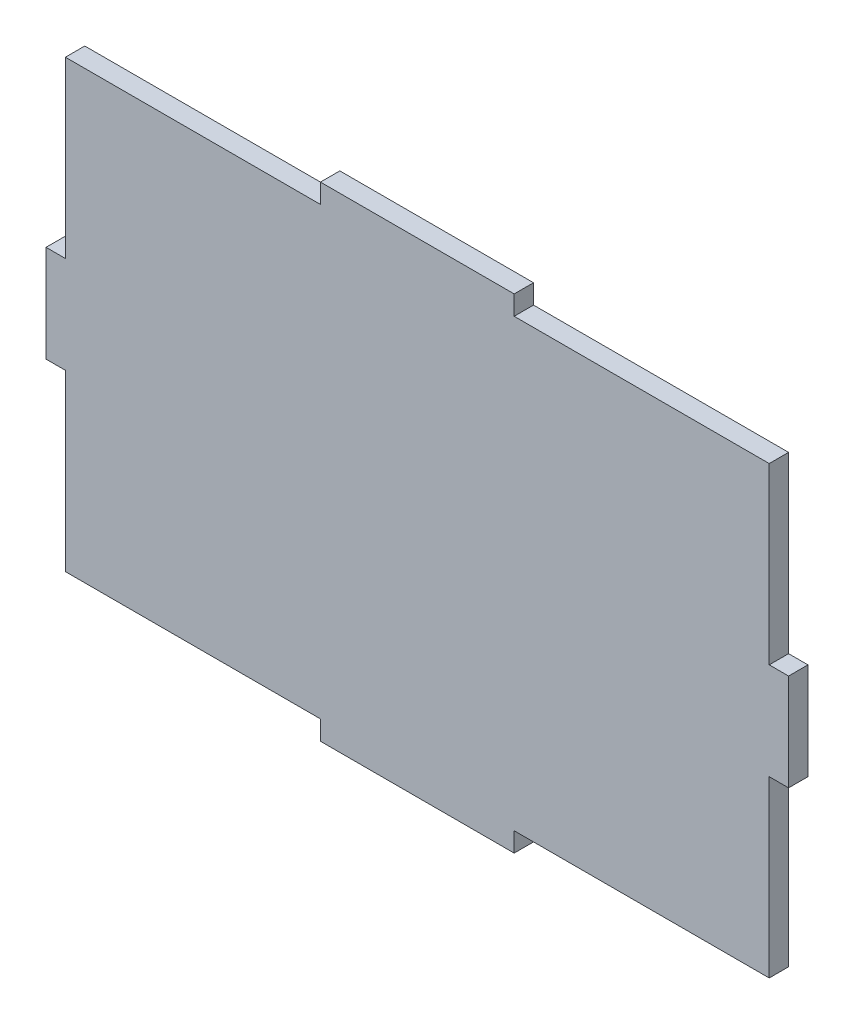
ISO-10303-21;
HEADER;
FILE_DESCRIPTION(('STEP AP214'),'2;1');
FILE_NAME('part.step','',(''),(''),'','','');
FILE_SCHEMA(('AUTOMOTIVE_DESIGN { 1 0 10303 214 1 1 1 1 }'));
ENDSEC;
DATA;
#1=APPLICATION_CONTEXT('core data for automotive mechanical design processes');
#2=APPLICATION_PROTOCOL_DEFINITION('international standard','automotive_design',2000,#1);
#3=PRODUCT_CONTEXT('',#1,'mechanical');
#4=PRODUCT('Part','Part','',(#3));
#5=PRODUCT_RELATED_PRODUCT_CATEGORY('part','',(#4));
#6=PRODUCT_DEFINITION_FORMATION('','',#4);
#7=PRODUCT_DEFINITION_CONTEXT('part definition',#1,'design');
#8=PRODUCT_DEFINITION('design','',#6,#7);
#9=PRODUCT_DEFINITION_SHAPE('','',#8);
#10=(LENGTH_UNIT() NAMED_UNIT(*) SI_UNIT(.MILLI.,.METRE.));
#11=(NAMED_UNIT(*) PLANE_ANGLE_UNIT() SI_UNIT($,.RADIAN.));
#12=(NAMED_UNIT(*) SI_UNIT($,.STERADIAN.) SOLID_ANGLE_UNIT());
#13=UNCERTAINTY_MEASURE_WITH_UNIT(LENGTH_MEASURE(1.E-05),#10,'distance_accuracy_value','');
#14=(GEOMETRIC_REPRESENTATION_CONTEXT(3) GLOBAL_UNCERTAINTY_ASSIGNED_CONTEXT((#13)) GLOBAL_UNIT_ASSIGNED_CONTEXT((#10,
#11,#12)) REPRESENTATION_CONTEXT('',''));
#15=CARTESIAN_POINT('',(0.,0.,0.));
#16=DIRECTION('',(0.,0.,1.));
#17=DIRECTION('',(1.,0.,0.));
#18=AXIS2_PLACEMENT_3D('',#15,#16,#17);
#19=CARTESIAN_POINT('',(0.,30.,3.));
#20=DIRECTION('',(0.,-1.,0.));
#21=DIRECTION('',(0.,0.,-1.));
#22=AXIS2_PLACEMENT_3D('',#19,#20,#21);
#23=PLANE('',#22);
#24=DIRECTION('',(-1.,0.,0.));
#25=VECTOR('',#24,1.);
#26=CARTESIAN_POINT('',(0.,30.,0.));
#27=LINE('',#26,#25);
#28=CARTESIAN_POINT('',(3.,30.,0.));
#29=VERTEX_POINT('',#28);
#30=CARTESIAN_POINT('',(0.,30.,0.));
#31=VERTEX_POINT('',#30);
#32=EDGE_CURVE('E202',#29,#31,#27,.T.);
#33=ORIENTED_EDGE('',*,*,#32,.F.);
#34=DIRECTION('',(0.,0.,-1.));
#35=VECTOR('',#34,1.);
#36=CARTESIAN_POINT('',(3.,30.,3.));
#37=LINE('',#36,#35);
#38=CARTESIAN_POINT('',(3.,30.,3.));
#39=VERTEX_POINT('',#38);
#40=EDGE_CURVE('E11',#39,#29,#37,.T.);
#41=ORIENTED_EDGE('',*,*,#40,.F.);
#42=DIRECTION('',(-1.,0.,0.));
#43=VECTOR('',#42,1.);
#44=CARTESIAN_POINT('',(0.,30.,3.));
#45=LINE('',#44,#43);
#46=CARTESIAN_POINT('',(0.,30.,3.));
#47=VERTEX_POINT('',#46);
#48=EDGE_CURVE('E258',#39,#47,#45,.T.);
#49=ORIENTED_EDGE('',*,*,#48,.T.);
#50=DIRECTION('',(0.,0.,-1.));
#51=VECTOR('',#50,1.);
#52=CARTESIAN_POINT('',(0.,30.,3.));
#53=LINE('',#52,#51);
#54=EDGE_CURVE('E53',#47,#31,#53,.T.);
#55=ORIENTED_EDGE('',*,*,#54,.T.);
#56=EDGE_LOOP('',(#33,#41,#49,#55));
#57=FACE_BOUND('',#56,.T.);
#58=ADVANCED_FACE('F37',(#57),#23,.T.);
#59=CARTESIAN_POINT('',(3.,0.,3.));
#60=DIRECTION('',(-1.,0.,0.));
#61=DIRECTION('',(0.,-1.,0.));
#62=AXIS2_PLACEMENT_3D('',#59,#60,#61);
#63=PLANE('',#62);
#64=DIRECTION('',(0.,1.,0.));
#65=VECTOR('',#64,1.);
#66=CARTESIAN_POINT('',(3.,0.,0.));
#67=LINE('',#66,#65);
#68=CARTESIAN_POINT('',(3.,2.99999999999999,0.));
#69=VERTEX_POINT('',#68);
#70=EDGE_CURVE('E204',#69,#29,#67,.T.);
#71=ORIENTED_EDGE('',*,*,#70,.F.);
#72=DIRECTION('',(0.,0.,-1.));
#73=VECTOR('',#72,1.);
#74=CARTESIAN_POINT('',(3.,2.99999999999999,3.));
#75=LINE('',#74,#73);
#76=CARTESIAN_POINT('',(3.,2.99999999999999,3.));
#77=VERTEX_POINT('',#76);
#78=EDGE_CURVE('E45',#77,#69,#75,.T.);
#79=ORIENTED_EDGE('',*,*,#78,.F.);
#80=DIRECTION('',(0.,1.,0.));
#81=VECTOR('',#80,1.);
#82=CARTESIAN_POINT('',(3.,0.,3.));
#83=LINE('',#82,#81);
#84=EDGE_CURVE('E310',#77,#39,#83,.T.);
#85=ORIENTED_EDGE('',*,*,#84,.T.);
#86=ORIENTED_EDGE('',*,*,#40,.T.);
#87=EDGE_LOOP('',(#71,#79,#85,#86));
#88=FACE_BOUND('',#87,.T.);
#89=ADVANCED_FACE('F299',(#88),#63,.T.);
#90=CARTESIAN_POINT('',(0.,2.99999999999999,3.));
#91=DIRECTION('',(0.,-1.,0.));
#92=DIRECTION('',(1.,0.,0.));
#93=AXIS2_PLACEMENT_3D('',#90,#91,#92);
#94=PLANE('',#93);
#95=DIRECTION('',(-1.,0.,0.));
#96=VECTOR('',#95,1.);
#97=CARTESIAN_POINT('',(0.,2.99999999999999,0.));
#98=LINE('',#97,#96);
#99=CARTESIAN_POINT('',(42.5,3.,0.));
#100=VERTEX_POINT('',#99);
#101=EDGE_CURVE('E207',#100,#69,#98,.T.);
#102=ORIENTED_EDGE('',*,*,#101,.F.);
#103=DIRECTION('',(0.,0.,-1.));
#104=VECTOR('',#103,1.);
#105=CARTESIAN_POINT('',(42.5,3.,3.));
#106=LINE('',#105,#104);
#107=CARTESIAN_POINT('',(42.5,3.,3.));
#108=VERTEX_POINT('',#107);
#109=EDGE_CURVE('E288',#108,#100,#106,.T.);
#110=ORIENTED_EDGE('',*,*,#109,.F.);
#111=DIRECTION('',(-1.,0.,0.));
#112=VECTOR('',#111,1.);
#113=CARTESIAN_POINT('',(0.,2.99999999999999,3.));
#114=LINE('',#113,#112);
#115=EDGE_CURVE('E295',#108,#77,#114,.T.);
#116=ORIENTED_EDGE('',*,*,#115,.T.);
#117=ORIENTED_EDGE('',*,*,#78,.T.);
#118=EDGE_LOOP('',(#102,#110,#116,#117));
#119=FACE_BOUND('',#118,.T.);
#120=ADVANCED_FACE('F293',(#119),#94,.T.);
#121=CARTESIAN_POINT('',(42.5,0.,3.));
#122=DIRECTION('',(-1.,0.,0.));
#123=DIRECTION('',(0.,0.,1.));
#124=AXIS2_PLACEMENT_3D('',#121,#122,#123);
#125=PLANE('',#124);
#126=DIRECTION('',(0.,1.,0.));
#127=VECTOR('',#126,1.);
#128=CARTESIAN_POINT('',(42.5,0.,0.));
#129=LINE('',#128,#127);
#130=CARTESIAN_POINT('',(42.5,0.,0.));
#131=VERTEX_POINT('',#130);
#132=EDGE_CURVE('E210',#131,#100,#129,.T.);
#133=ORIENTED_EDGE('',*,*,#132,.F.);
#134=DIRECTION('',(0.,0.,-1.));
#135=VECTOR('',#134,1.);
#136=CARTESIAN_POINT('',(42.5,0.,3.));
#137=LINE('',#136,#135);
#138=CARTESIAN_POINT('',(42.5,0.,3.));
#139=VERTEX_POINT('',#138);
#140=EDGE_CURVE('E286',#139,#131,#137,.T.);
#141=ORIENTED_EDGE('',*,*,#140,.F.);
#142=DIRECTION('',(0.,1.,0.));
#143=VECTOR('',#142,1.);
#144=CARTESIAN_POINT('',(42.5,0.,3.));
#145=LINE('',#144,#143);
#146=EDGE_CURVE('E309',#139,#108,#145,.T.);
#147=ORIENTED_EDGE('',*,*,#146,.T.);
#148=ORIENTED_EDGE('',*,*,#109,.T.);
#149=EDGE_LOOP('',(#133,#141,#147,#148));
#150=FACE_BOUND('',#149,.T.);
#151=ADVANCED_FACE('F305',(#150),#125,.T.);
#152=CARTESIAN_POINT('',(0.,0.,3.));
#153=DIRECTION('',(0.,1.,0.));
#154=DIRECTION('',(0.,0.,1.));
#155=AXIS2_PLACEMENT_3D('',#152,#153,#154);
#156=PLANE('',#155);
#157=DIRECTION('',(1.,0.,0.));
#158=VECTOR('',#157,1.);
#159=CARTESIAN_POINT('',(0.,0.,0.));
#160=LINE('',#159,#158);
#161=CARTESIAN_POINT('',(72.5,0.,0.));
#162=VERTEX_POINT('',#161);
#163=EDGE_CURVE('E213',#131,#162,#160,.T.);
#164=ORIENTED_EDGE('',*,*,#163,.T.);
#165=DIRECTION('',(0.,0.,-1.));
#166=VECTOR('',#165,1.);
#167=CARTESIAN_POINT('',(72.5,0.,3.));
#168=LINE('',#167,#166);
#169=CARTESIAN_POINT('',(72.5,0.,3.));
#170=VERTEX_POINT('',#169);
#171=EDGE_CURVE('E284',#170,#162,#168,.T.);
#172=ORIENTED_EDGE('',*,*,#171,.F.);
#173=DIRECTION('',(1.,0.,0.));
#174=VECTOR('',#173,1.);
#175=CARTESIAN_POINT('',(0.,0.,3.));
#176=LINE('',#175,#174);
#177=EDGE_CURVE('E312',#139,#170,#176,.T.);
#178=ORIENTED_EDGE('',*,*,#177,.F.);
#179=ORIENTED_EDGE('',*,*,#140,.T.);
#180=EDGE_LOOP('',(#164,#172,#178,#179));
#181=FACE_BOUND('',#180,.T.);
#182=ADVANCED_FACE('F374',(#181),#156,.F.);
#183=CARTESIAN_POINT('',(72.5,0.,3.));
#184=DIRECTION('',(1.,0.,0.));
#185=DIRECTION('',(0.,0.,-1.));
#186=AXIS2_PLACEMENT_3D('',#183,#184,#185);
#187=PLANE('',#186);
#188=DIRECTION('',(0.,-1.,0.));
#189=VECTOR('',#188,1.);
#190=CARTESIAN_POINT('',(72.5,0.,0.));
#191=LINE('',#190,#189);
#192=CARTESIAN_POINT('',(72.5,3.,0.));
#193=VERTEX_POINT('',#192);
#194=EDGE_CURVE('E216',#193,#162,#191,.T.);
#195=ORIENTED_EDGE('',*,*,#194,.F.);
#196=DIRECTION('',(0.,0.,-1.));
#197=VECTOR('',#196,1.);
#198=CARTESIAN_POINT('',(72.5,3.,3.));
#199=LINE('',#198,#197);
#200=CARTESIAN_POINT('',(72.5,3.,3.));
#201=VERTEX_POINT('',#200);
#202=EDGE_CURVE('E282',#201,#193,#199,.T.);
#203=ORIENTED_EDGE('',*,*,#202,.F.);
#204=DIRECTION('',(0.,-1.,0.));
#205=VECTOR('',#204,1.);
#206=CARTESIAN_POINT('',(72.5,0.,3.));
#207=LINE('',#206,#205);
#208=EDGE_CURVE('E318',#201,#170,#207,.T.);
#209=ORIENTED_EDGE('',*,*,#208,.T.);
#210=ORIENTED_EDGE('',*,*,#171,.T.);
#211=EDGE_LOOP('',(#195,#203,#209,#210));
#212=FACE_BOUND('',#211,.T.);
#213=ADVANCED_FACE('F377',(#212),#187,.T.);
#214=CARTESIAN_POINT('',(0.,2.99999999999998,3.));
#215=DIRECTION('',(0.,-1.,0.));
#216=DIRECTION('',(1.,0.,0.));
#217=AXIS2_PLACEMENT_3D('',#214,#215,#216);
#218=PLANE('',#217);
#219=DIRECTION('',(-1.,0.,0.));
#220=VECTOR('',#219,1.);
#221=CARTESIAN_POINT('',(0.,2.99999999999998,0.));
#222=LINE('',#221,#220);
#223=CARTESIAN_POINT('',(112.,3.00000000000001,0.));
#224=VERTEX_POINT('',#223);
#225=EDGE_CURVE('E219',#224,#193,#222,.T.);
#226=ORIENTED_EDGE('',*,*,#225,.F.);
#227=DIRECTION('',(0.,0.,-1.));
#228=VECTOR('',#227,1.);
#229=CARTESIAN_POINT('',(112.,3.00000000000001,3.));
#230=LINE('',#229,#228);
#231=CARTESIAN_POINT('',(112.,3.00000000000001,3.));
#232=VERTEX_POINT('',#231);
#233=EDGE_CURVE('E280',#232,#224,#230,.T.);
#234=ORIENTED_EDGE('',*,*,#233,.F.);
#235=DIRECTION('',(-1.,0.,0.));
#236=VECTOR('',#235,1.);
#237=CARTESIAN_POINT('',(0.,2.99999999999998,3.));
#238=LINE('',#237,#236);
#239=EDGE_CURVE('E321',#232,#201,#238,.T.);
#240=ORIENTED_EDGE('',*,*,#239,.T.);
#241=ORIENTED_EDGE('',*,*,#202,.T.);
#242=EDGE_LOOP('',(#226,#234,#240,#241));
#243=FACE_BOUND('',#242,.T.);
#244=ADVANCED_FACE('F381',(#243),#218,.T.);
#245=CARTESIAN_POINT('',(112.,0.,3.));
#246=DIRECTION('',(1.,0.,0.));
#247=DIRECTION('',(0.,0.,-1.));
#248=AXIS2_PLACEMENT_3D('',#245,#246,#247);
#249=PLANE('',#248);
#250=DIRECTION('',(0.,-1.,0.));
#251=VECTOR('',#250,1.);
#252=CARTESIAN_POINT('',(112.,0.,0.));
#253=LINE('',#252,#251);
#254=CARTESIAN_POINT('',(112.,30.,0.));
#255=VERTEX_POINT('',#254);
#256=EDGE_CURVE('E222',#255,#224,#253,.T.);
#257=ORIENTED_EDGE('',*,*,#256,.F.);
#258=DIRECTION('',(0.,0.,-1.));
#259=VECTOR('',#258,1.);
#260=CARTESIAN_POINT('',(112.,30.,3.));
#261=LINE('',#260,#259);
#262=CARTESIAN_POINT('',(112.,30.,3.));
#263=VERTEX_POINT('',#262);
#264=EDGE_CURVE('E278',#263,#255,#261,.T.);
#265=ORIENTED_EDGE('',*,*,#264,.F.);
#266=DIRECTION('',(0.,-1.,0.));
#267=VECTOR('',#266,1.);
#268=CARTESIAN_POINT('',(112.,0.,3.));
#269=LINE('',#268,#267);
#270=EDGE_CURVE('E324',#263,#232,#269,.T.);
#271=ORIENTED_EDGE('',*,*,#270,.T.);
#272=ORIENTED_EDGE('',*,*,#233,.T.);
#273=EDGE_LOOP('',(#257,#265,#271,#272));
#274=FACE_BOUND('',#273,.T.);
#275=ADVANCED_FACE('F385',(#274),#249,.T.);
#276=CARTESIAN_POINT('',(0.,30.,3.));
#277=DIRECTION('',(0.,-1.,0.));
#278=DIRECTION('',(0.,0.,-1.));
#279=AXIS2_PLACEMENT_3D('',#276,#277,#278);
#280=PLANE('',#279);
#281=DIRECTION('',(-1.,0.,0.));
#282=VECTOR('',#281,1.);
#283=CARTESIAN_POINT('',(0.,30.,0.));
#284=LINE('',#283,#282);
#285=CARTESIAN_POINT('',(115.,30.,0.));
#286=VERTEX_POINT('',#285);
#287=EDGE_CURVE('E225',#286,#255,#284,.T.);
#288=ORIENTED_EDGE('',*,*,#287,.F.);
#289=DIRECTION('',(0.,0.,-1.));
#290=VECTOR('',#289,1.);
#291=CARTESIAN_POINT('',(115.,30.,3.));
#292=LINE('',#291,#290);
#293=CARTESIAN_POINT('',(115.,30.,3.));
#294=VERTEX_POINT('',#293);
#295=EDGE_CURVE('E276',#294,#286,#292,.T.);
#296=ORIENTED_EDGE('',*,*,#295,.F.);
#297=DIRECTION('',(-1.,0.,0.));
#298=VECTOR('',#297,1.);
#299=CARTESIAN_POINT('',(0.,30.,3.));
#300=LINE('',#299,#298);
#301=EDGE_CURVE('E327',#294,#263,#300,.T.);
#302=ORIENTED_EDGE('',*,*,#301,.T.);
#303=ORIENTED_EDGE('',*,*,#264,.T.);
#304=EDGE_LOOP('',(#288,#296,#302,#303));
#305=FACE_BOUND('',#304,.T.);
#306=ADVANCED_FACE('F389',(#305),#280,.T.);
#307=CARTESIAN_POINT('',(115.,0.,3.));
#308=DIRECTION('',(-1.,0.,0.));
#309=DIRECTION('',(0.,0.,1.));
#310=AXIS2_PLACEMENT_3D('',#307,#308,#309);
#311=PLANE('',#310);
#312=DIRECTION('',(0.,1.,0.));
#313=VECTOR('',#312,1.);
#314=CARTESIAN_POINT('',(115.,0.,0.));
#315=LINE('',#314,#313);
#316=CARTESIAN_POINT('',(115.,45.,0.));
#317=VERTEX_POINT('',#316);
#318=EDGE_CURVE('E228',#286,#317,#315,.T.);
#319=ORIENTED_EDGE('',*,*,#318,.T.);
#320=DIRECTION('',(0.,0.,-1.));
#321=VECTOR('',#320,1.);
#322=CARTESIAN_POINT('',(115.,45.,3.));
#323=LINE('',#322,#321);
#324=CARTESIAN_POINT('',(115.,45.,3.));
#325=VERTEX_POINT('',#324);
#326=EDGE_CURVE('E274',#325,#317,#323,.T.);
#327=ORIENTED_EDGE('',*,*,#326,.F.);
#328=DIRECTION('',(0.,1.,0.));
#329=VECTOR('',#328,1.);
#330=CARTESIAN_POINT('',(115.,0.,3.));
#331=LINE('',#330,#329);
#332=EDGE_CURVE('E330',#294,#325,#331,.T.);
#333=ORIENTED_EDGE('',*,*,#332,.F.);
#334=ORIENTED_EDGE('',*,*,#295,.T.);
#335=EDGE_LOOP('',(#319,#327,#333,#334));
#336=FACE_BOUND('',#335,.T.);
#337=ADVANCED_FACE('F393',(#336),#311,.F.);
#338=CARTESIAN_POINT('',(0.,45.,3.));
#339=DIRECTION('',(0.,1.,0.));
#340=DIRECTION('',(0.,0.,1.));
#341=AXIS2_PLACEMENT_3D('',#338,#339,#340);
#342=PLANE('',#341);
#343=DIRECTION('',(1.,0.,0.));
#344=VECTOR('',#343,1.);
#345=CARTESIAN_POINT('',(0.,45.,0.));
#346=LINE('',#345,#344);
#347=CARTESIAN_POINT('',(112.,45.,0.));
#348=VERTEX_POINT('',#347);
#349=EDGE_CURVE('E231',#348,#317,#346,.T.);
#350=ORIENTED_EDGE('',*,*,#349,.F.);
#351=DIRECTION('',(0.,0.,-1.));
#352=VECTOR('',#351,1.);
#353=CARTESIAN_POINT('',(112.,45.,3.));
#354=LINE('',#353,#352);
#355=CARTESIAN_POINT('',(112.,45.,3.));
#356=VERTEX_POINT('',#355);
#357=EDGE_CURVE('E272',#356,#348,#354,.T.);
#358=ORIENTED_EDGE('',*,*,#357,.F.);
#359=DIRECTION('',(1.,0.,0.));
#360=VECTOR('',#359,1.);
#361=CARTESIAN_POINT('',(0.,45.,3.));
#362=LINE('',#361,#360);
#363=EDGE_CURVE('E332',#356,#325,#362,.T.);
#364=ORIENTED_EDGE('',*,*,#363,.T.);
#365=ORIENTED_EDGE('',*,*,#326,.T.);
#366=EDGE_LOOP('',(#350,#358,#364,#365));
#367=FACE_BOUND('',#366,.T.);
#368=ADVANCED_FACE('F397',(#367),#342,.T.);
#369=CARTESIAN_POINT('',(112.,0.,3.));
#370=DIRECTION('',(1.,0.,0.));
#371=DIRECTION('',(0.,0.,-1.));
#372=AXIS2_PLACEMENT_3D('',#369,#370,#371);
#373=PLANE('',#372);
#374=DIRECTION('',(0.,-1.,0.));
#375=VECTOR('',#374,1.);
#376=CARTESIAN_POINT('',(112.,0.,0.));
#377=LINE('',#376,#375);
#378=CARTESIAN_POINT('',(112.,72.,0.));
#379=VERTEX_POINT('',#378);
#380=EDGE_CURVE('E234',#379,#348,#377,.T.);
#381=ORIENTED_EDGE('',*,*,#380,.F.);
#382=DIRECTION('',(0.,0.,-1.));
#383=VECTOR('',#382,1.);
#384=CARTESIAN_POINT('',(112.,72.,3.));
#385=LINE('',#384,#383);
#386=CARTESIAN_POINT('',(112.,72.,3.));
#387=VERTEX_POINT('',#386);
#388=EDGE_CURVE('E270',#387,#379,#385,.T.);
#389=ORIENTED_EDGE('',*,*,#388,.F.);
#390=DIRECTION('',(0.,-1.,0.));
#391=VECTOR('',#390,1.);
#392=CARTESIAN_POINT('',(112.,0.,3.));
#393=LINE('',#392,#391);
#394=EDGE_CURVE('E335',#387,#356,#393,.T.);
#395=ORIENTED_EDGE('',*,*,#394,.T.);
#396=ORIENTED_EDGE('',*,*,#357,.T.);
#397=EDGE_LOOP('',(#381,#389,#395,#396));
#398=FACE_BOUND('',#397,.T.);
#399=ADVANCED_FACE('F401',(#398),#373,.T.);
#400=CARTESIAN_POINT('',(0.,72.,3.));
#401=DIRECTION('',(0.,1.,0.));
#402=DIRECTION('',(0.,0.,1.));
#403=AXIS2_PLACEMENT_3D('',#400,#401,#402);
#404=PLANE('',#403);
#405=DIRECTION('',(1.,0.,0.));
#406=VECTOR('',#405,1.);
#407=CARTESIAN_POINT('',(0.,72.,0.));
#408=LINE('',#407,#406);
#409=CARTESIAN_POINT('',(72.5,72.,0.));
#410=VERTEX_POINT('',#409);
#411=EDGE_CURVE('E237',#410,#379,#408,.T.);
#412=ORIENTED_EDGE('',*,*,#411,.F.);
#413=DIRECTION('',(0.,0.,-1.));
#414=VECTOR('',#413,1.);
#415=CARTESIAN_POINT('',(72.5,72.,3.));
#416=LINE('',#415,#414);
#417=CARTESIAN_POINT('',(72.5,72.,3.));
#418=VERTEX_POINT('',#417);
#419=EDGE_CURVE('E268',#418,#410,#416,.T.);
#420=ORIENTED_EDGE('',*,*,#419,.F.);
#421=DIRECTION('',(1.,0.,0.));
#422=VECTOR('',#421,1.);
#423=CARTESIAN_POINT('',(0.,72.,3.));
#424=LINE('',#423,#422);
#425=EDGE_CURVE('E338',#418,#387,#424,.T.);
#426=ORIENTED_EDGE('',*,*,#425,.T.);
#427=ORIENTED_EDGE('',*,*,#388,.T.);
#428=EDGE_LOOP('',(#412,#420,#426,#427));
#429=FACE_BOUND('',#428,.T.);
#430=ADVANCED_FACE('F405',(#429),#404,.T.);
#431=CARTESIAN_POINT('',(72.4999999999997,-3.35379872022181E-13,3.));
#432=DIRECTION('',(1.,0.,0.));
#433=DIRECTION('',(0.,1.,0.));
#434=AXIS2_PLACEMENT_3D('',#431,#432,#433);
#435=PLANE('',#434);
#436=DIRECTION('',(0.,-1.,0.));
#437=VECTOR('',#436,1.);
#438=CARTESIAN_POINT('',(72.4999999999997,-3.35379872022181E-13,0.));
#439=LINE('',#438,#437);
#440=CARTESIAN_POINT('',(72.5,75.,0.));
#441=VERTEX_POINT('',#440);
#442=EDGE_CURVE('E240',#441,#410,#439,.T.);
#443=ORIENTED_EDGE('',*,*,#442,.F.);
#444=DIRECTION('',(0.,0.,-1.));
#445=VECTOR('',#444,1.);
#446=CARTESIAN_POINT('',(72.5,75.,3.));
#447=LINE('',#446,#445);
#448=CARTESIAN_POINT('',(72.5,75.,3.));
#449=VERTEX_POINT('',#448);
#450=EDGE_CURVE('E266',#449,#441,#447,.T.);
#451=ORIENTED_EDGE('',*,*,#450,.F.);
#452=DIRECTION('',(0.,-1.,0.));
#453=VECTOR('',#452,1.);
#454=CARTESIAN_POINT('',(72.4999999999997,-3.35379872022181E-13,3.));
#455=LINE('',#454,#453);
#456=EDGE_CURVE('E341',#449,#418,#455,.T.);
#457=ORIENTED_EDGE('',*,*,#456,.T.);
#458=ORIENTED_EDGE('',*,*,#419,.T.);
#459=EDGE_LOOP('',(#443,#451,#457,#458));
#460=FACE_BOUND('',#459,.T.);
#461=ADVANCED_FACE('F409',(#460),#435,.T.);
#462=CARTESIAN_POINT('',(0.,75.,3.));
#463=DIRECTION('',(0.,1.,0.));
#464=DIRECTION('',(0.,0.,1.));
#465=AXIS2_PLACEMENT_3D('',#462,#463,#464);
#466=PLANE('',#465);
#467=DIRECTION('',(1.,0.,0.));
#468=VECTOR('',#467,1.);
#469=CARTESIAN_POINT('',(0.,75.,0.));
#470=LINE('',#469,#468);
#471=CARTESIAN_POINT('',(42.5,75.,0.));
#472=VERTEX_POINT('',#471);
#473=EDGE_CURVE('E243',#472,#441,#470,.T.);
#474=ORIENTED_EDGE('',*,*,#473,.F.);
#475=DIRECTION('',(0.,0.,-1.));
#476=VECTOR('',#475,1.);
#477=CARTESIAN_POINT('',(42.5,75.,3.));
#478=LINE('',#477,#476);
#479=CARTESIAN_POINT('',(42.5,75.,3.));
#480=VERTEX_POINT('',#479);
#481=EDGE_CURVE('E264',#480,#472,#478,.T.);
#482=ORIENTED_EDGE('',*,*,#481,.F.);
#483=DIRECTION('',(1.,0.,0.));
#484=VECTOR('',#483,1.);
#485=CARTESIAN_POINT('',(0.,75.,3.));
#486=LINE('',#485,#484);
#487=EDGE_CURVE('E344',#480,#449,#486,.T.);
#488=ORIENTED_EDGE('',*,*,#487,.T.);
#489=ORIENTED_EDGE('',*,*,#450,.T.);
#490=EDGE_LOOP('',(#474,#482,#488,#489));
#491=FACE_BOUND('',#490,.T.);
#492=ADVANCED_FACE('F413',(#491),#466,.T.);
#493=CARTESIAN_POINT('',(42.5000000000002,0.,3.));
#494=DIRECTION('',(-1.,0.,0.));
#495=DIRECTION('',(0.,-1.,0.));
#496=AXIS2_PLACEMENT_3D('',#493,#494,#495);
#497=PLANE('',#496);
#498=DIRECTION('',(0.,1.,0.));
#499=VECTOR('',#498,1.);
#500=CARTESIAN_POINT('',(42.5000000000002,0.,0.));
#501=LINE('',#500,#499);
#502=CARTESIAN_POINT('',(42.5,72.,0.));
#503=VERTEX_POINT('',#502);
#504=EDGE_CURVE('E246',#503,#472,#501,.T.);
#505=ORIENTED_EDGE('',*,*,#504,.F.);
#506=DIRECTION('',(0.,0.,-1.));
#507=VECTOR('',#506,1.);
#508=CARTESIAN_POINT('',(42.5,72.,3.));
#509=LINE('',#508,#507);
#510=CARTESIAN_POINT('',(42.5,72.,3.));
#511=VERTEX_POINT('',#510);
#512=EDGE_CURVE('E262',#511,#503,#509,.T.);
#513=ORIENTED_EDGE('',*,*,#512,.F.);
#514=DIRECTION('',(0.,1.,0.));
#515=VECTOR('',#514,1.);
#516=CARTESIAN_POINT('',(42.5000000000002,0.,3.));
#517=LINE('',#516,#515);
#518=EDGE_CURVE('E347',#511,#480,#517,.T.);
#519=ORIENTED_EDGE('',*,*,#518,.T.);
#520=ORIENTED_EDGE('',*,*,#481,.T.);
#521=EDGE_LOOP('',(#505,#513,#519,#520));
#522=FACE_BOUND('',#521,.T.);
#523=ADVANCED_FACE('F417',(#522),#497,.T.);
#524=CARTESIAN_POINT('',(0.,72.,3.));
#525=DIRECTION('',(0.,1.,0.));
#526=DIRECTION('',(0.,0.,1.));
#527=AXIS2_PLACEMENT_3D('',#524,#525,#526);
#528=PLANE('',#527);
#529=DIRECTION('',(1.,0.,0.));
#530=VECTOR('',#529,1.);
#531=CARTESIAN_POINT('',(0.,72.,0.));
#532=LINE('',#531,#530);
#533=CARTESIAN_POINT('',(3.,72.,0.));
#534=VERTEX_POINT('',#533);
#535=EDGE_CURVE('E249',#534,#503,#532,.T.);
#536=ORIENTED_EDGE('',*,*,#535,.F.);
#537=DIRECTION('',(0.,0.,-1.));
#538=VECTOR('',#537,1.);
#539=CARTESIAN_POINT('',(3.,72.,3.));
#540=LINE('',#539,#538);
#541=CARTESIAN_POINT('',(3.,72.,3.));
#542=VERTEX_POINT('',#541);
#543=EDGE_CURVE('E184',#542,#534,#540,.T.);
#544=ORIENTED_EDGE('',*,*,#543,.F.);
#545=DIRECTION('',(1.,0.,0.));
#546=VECTOR('',#545,1.);
#547=CARTESIAN_POINT('',(0.,72.,3.));
#548=LINE('',#547,#546);
#549=EDGE_CURVE('E194',#542,#511,#548,.T.);
#550=ORIENTED_EDGE('',*,*,#549,.T.);
#551=ORIENTED_EDGE('',*,*,#512,.T.);
#552=EDGE_LOOP('',(#536,#544,#550,#551));
#553=FACE_BOUND('',#552,.T.);
#554=ADVANCED_FACE('F351',(#553),#528,.T.);
#555=CARTESIAN_POINT('',(3.,0.,3.));
#556=DIRECTION('',(-1.,0.,0.));
#557=DIRECTION('',(0.,0.,1.));
#558=AXIS2_PLACEMENT_3D('',#555,#556,#557);
#559=PLANE('',#558);
#560=DIRECTION('',(0.,1.,0.));
#561=VECTOR('',#560,1.);
#562=CARTESIAN_POINT('',(3.,0.,0.));
#563=LINE('',#562,#561);
#564=CARTESIAN_POINT('',(3.,45.,0.));
#565=VERTEX_POINT('',#564);
#566=EDGE_CURVE('E180',#565,#534,#563,.T.);
#567=ORIENTED_EDGE('',*,*,#566,.F.);
#568=DIRECTION('',(0.,0.,-1.));
#569=VECTOR('',#568,1.);
#570=CARTESIAN_POINT('',(3.,45.,3.));
#571=LINE('',#570,#569);
#572=CARTESIAN_POINT('',(3.,45.,3.));
#573=VERTEX_POINT('',#572);
#574=EDGE_CURVE('E175',#573,#565,#571,.T.);
#575=ORIENTED_EDGE('',*,*,#574,.F.);
#576=DIRECTION('',(0.,1.,0.));
#577=VECTOR('',#576,1.);
#578=CARTESIAN_POINT('',(3.,0.,3.));
#579=LINE('',#578,#577);
#580=EDGE_CURVE('E178',#573,#542,#579,.T.);
#581=ORIENTED_EDGE('',*,*,#580,.T.);
#582=ORIENTED_EDGE('',*,*,#543,.T.);
#583=EDGE_LOOP('',(#567,#575,#581,#582));
#584=FACE_BOUND('',#583,.T.);
#585=ADVANCED_FACE('F177',(#584),#559,.T.);
#586=CARTESIAN_POINT('',(0.,45.,3.));
#587=DIRECTION('',(0.,1.,0.));
#588=DIRECTION('',(0.,0.,1.));
#589=AXIS2_PLACEMENT_3D('',#586,#587,#588);
#590=PLANE('',#589);
#591=DIRECTION('',(1.,0.,0.));
#592=VECTOR('',#591,1.);
#593=CARTESIAN_POINT('',(0.,45.,0.));
#594=LINE('',#593,#592);
#595=CARTESIAN_POINT('',(0.,45.,0.));
#596=VERTEX_POINT('',#595);
#597=EDGE_CURVE('E253',#596,#565,#594,.T.);
#598=ORIENTED_EDGE('',*,*,#597,.F.);
#599=DIRECTION('',(0.,0.,-1.));
#600=VECTOR('',#599,1.);
#601=CARTESIAN_POINT('',(0.,45.,3.));
#602=LINE('',#601,#600);
#603=CARTESIAN_POINT('',(0.,45.,3.));
#604=VERTEX_POINT('',#603);
#605=EDGE_CURVE('E114',#604,#596,#602,.T.);
#606=ORIENTED_EDGE('',*,*,#605,.F.);
#607=DIRECTION('',(1.,0.,0.));
#608=VECTOR('',#607,1.);
#609=CARTESIAN_POINT('',(0.,45.,3.));
#610=LINE('',#609,#608);
#611=EDGE_CURVE('E191',#604,#573,#610,.T.);
#612=ORIENTED_EDGE('',*,*,#611,.T.);
#613=ORIENTED_EDGE('',*,*,#574,.T.);
#614=EDGE_LOOP('',(#598,#606,#612,#613));
#615=FACE_BOUND('',#614,.T.);
#616=ADVANCED_FACE('F196',(#615),#590,.T.);
#617=CARTESIAN_POINT('',(0.,0.,3.));
#618=DIRECTION('',(-1.,0.,0.));
#619=DIRECTION('',(0.,0.,1.));
#620=AXIS2_PLACEMENT_3D('',#617,#618,#619);
#621=PLANE('',#620);
#622=DIRECTION('',(0.,1.,0.));
#623=VECTOR('',#622,1.);
#624=CARTESIAN_POINT('',(0.,0.,0.));
#625=LINE('',#624,#623);
#626=EDGE_CURVE('E255',#31,#596,#625,.T.);
#627=ORIENTED_EDGE('',*,*,#626,.F.);
#628=ORIENTED_EDGE('',*,*,#54,.F.);
#629=DIRECTION('',(0.,1.,0.));
#630=VECTOR('',#629,1.);
#631=CARTESIAN_POINT('',(0.,0.,3.));
#632=LINE('',#631,#630);
#633=EDGE_CURVE('E197',#47,#604,#632,.T.);
#634=ORIENTED_EDGE('',*,*,#633,.T.);
#635=ORIENTED_EDGE('',*,*,#605,.T.);
#636=EDGE_LOOP('',(#627,#628,#634,#635));
#637=FACE_BOUND('',#636,.T.);
#638=ADVANCED_FACE('F353',(#637),#621,.T.);
#639=CARTESIAN_POINT('',(0.,0.,3.));
#640=DIRECTION('',(0.,0.,1.));
#641=DIRECTION('',(1.,0.,0.));
#642=AXIS2_PLACEMENT_3D('',#639,#640,#641);
#643=PLANE('',#642);
#644=ORIENTED_EDGE('',*,*,#48,.F.);
#645=ORIENTED_EDGE('',*,*,#84,.F.);
#646=ORIENTED_EDGE('',*,*,#115,.F.);
#647=ORIENTED_EDGE('',*,*,#146,.F.);
#648=ORIENTED_EDGE('',*,*,#177,.T.);
#649=ORIENTED_EDGE('',*,*,#208,.F.);
#650=ORIENTED_EDGE('',*,*,#239,.F.);
#651=ORIENTED_EDGE('',*,*,#270,.F.);
#652=ORIENTED_EDGE('',*,*,#301,.F.);
#653=ORIENTED_EDGE('',*,*,#332,.T.);
#654=ORIENTED_EDGE('',*,*,#363,.F.);
#655=ORIENTED_EDGE('',*,*,#394,.F.);
#656=ORIENTED_EDGE('',*,*,#425,.F.);
#657=ORIENTED_EDGE('',*,*,#456,.F.);
#658=ORIENTED_EDGE('',*,*,#487,.F.);
#659=ORIENTED_EDGE('',*,*,#518,.F.);
#660=ORIENTED_EDGE('',*,*,#549,.F.);
#661=ORIENTED_EDGE('',*,*,#580,.F.);
#662=ORIENTED_EDGE('',*,*,#611,.F.);
#663=ORIENTED_EDGE('',*,*,#633,.F.);
#664=EDGE_LOOP('',(#644,#645,#646,#647,#648,#649,#650,#651,#652,#653,#654,#655,#656,#657,#658,
#659,#660,#661,#662,#663));
#665=FACE_BOUND('',#664,.T.);
#666=ADVANCED_FACE('F189',(#665),#643,.T.);
#667=CARTESIAN_POINT('',(0.,0.,0.));
#668=DIRECTION('',(0.,0.,1.));
#669=DIRECTION('',(1.,0.,0.));
#670=AXIS2_PLACEMENT_3D('',#667,#668,#669);
#671=PLANE('',#670);
#672=ORIENTED_EDGE('',*,*,#32,.T.);
#673=ORIENTED_EDGE('',*,*,#626,.T.);
#674=ORIENTED_EDGE('',*,*,#597,.T.);
#675=ORIENTED_EDGE('',*,*,#566,.T.);
#676=ORIENTED_EDGE('',*,*,#535,.T.);
#677=ORIENTED_EDGE('',*,*,#504,.T.);
#678=ORIENTED_EDGE('',*,*,#473,.T.);
#679=ORIENTED_EDGE('',*,*,#442,.T.);
#680=ORIENTED_EDGE('',*,*,#411,.T.);
#681=ORIENTED_EDGE('',*,*,#380,.T.);
#682=ORIENTED_EDGE('',*,*,#349,.T.);
#683=ORIENTED_EDGE('',*,*,#318,.F.);
#684=ORIENTED_EDGE('',*,*,#287,.T.);
#685=ORIENTED_EDGE('',*,*,#256,.T.);
#686=ORIENTED_EDGE('',*,*,#225,.T.);
#687=ORIENTED_EDGE('',*,*,#194,.T.);
#688=ORIENTED_EDGE('',*,*,#163,.F.);
#689=ORIENTED_EDGE('',*,*,#132,.T.);
#690=ORIENTED_EDGE('',*,*,#101,.T.);
#691=ORIENTED_EDGE('',*,*,#70,.T.);
#692=EDGE_LOOP('',(#672,#673,#674,#675,#676,#677,#678,#679,#680,#681,#682,#683,#684,#685,#686,
#687,#688,#689,#690,#691));
#693=FACE_BOUND('',#692,.T.);
#694=ADVANCED_FACE('F301',(#693),#671,.F.);
#695=CLOSED_SHELL('',(#58,#89,#120,#151,#182,#213,#244,#275,#306,#337,#368,#399,#430,#461,#492,
#523,#554,#585,#616,#638,#666,#694));
#696=MANIFOLD_SOLID_BREP('B2',#695);
#697=ADVANCED_BREP_SHAPE_REPRESENTATION('',(#18,#696),#14);
#698=SHAPE_DEFINITION_REPRESENTATION(#9,#697);
ENDSEC;
END-ISO-10303-21;
